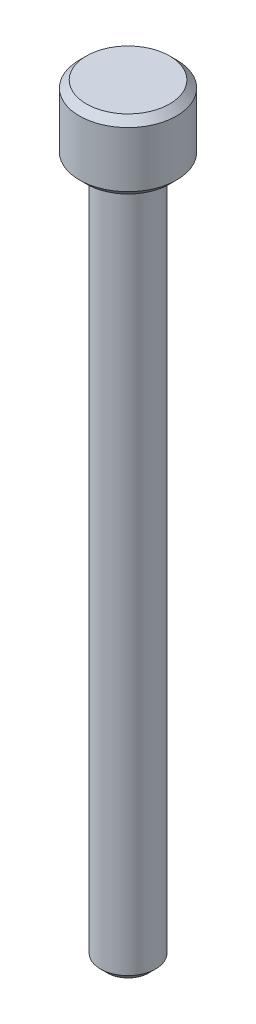
ISO-10303-21;
HEADER;
FILE_DESCRIPTION(('STEP AP214'),'2;1');
FILE_NAME('part.step','',(''),(''),'','','');
FILE_SCHEMA(('AUTOMOTIVE_DESIGN { 1 0 10303 214 1 1 1 1 }'));
ENDSEC;
DATA;
#1=APPLICATION_CONTEXT('core data for automotive mechanical design processes');
#2=APPLICATION_PROTOCOL_DEFINITION('international standard','automotive_design',2000,#1);
#3=PRODUCT_CONTEXT('',#1,'mechanical');
#4=PRODUCT('Part','Part','',(#3));
#5=PRODUCT_RELATED_PRODUCT_CATEGORY('part','',(#4));
#6=PRODUCT_DEFINITION_FORMATION('','',#4);
#7=PRODUCT_DEFINITION_CONTEXT('part definition',#1,'design');
#8=PRODUCT_DEFINITION('design','',#6,#7);
#9=PRODUCT_DEFINITION_SHAPE('','',#8);
#10=(LENGTH_UNIT() NAMED_UNIT(*) SI_UNIT(.MILLI.,.METRE.));
#11=(NAMED_UNIT(*) PLANE_ANGLE_UNIT() SI_UNIT($,.RADIAN.));
#12=(NAMED_UNIT(*) SI_UNIT($,.STERADIAN.) SOLID_ANGLE_UNIT());
#13=UNCERTAINTY_MEASURE_WITH_UNIT(LENGTH_MEASURE(1.E-05),#10,'distance_accuracy_value','');
#14=(GEOMETRIC_REPRESENTATION_CONTEXT(3) GLOBAL_UNCERTAINTY_ASSIGNED_CONTEXT((#13)) GLOBAL_UNIT_ASSIGNED_CONTEXT((#10,
#11,#12)) REPRESENTATION_CONTEXT('',''));
#15=CARTESIAN_POINT('',(0.,0.,0.));
#16=DIRECTION('',(0.,0.,1.));
#17=DIRECTION('',(1.,0.,0.));
#18=AXIS2_PLACEMENT_3D('',#15,#16,#17);
#19=CARTESIAN_POINT('',(6.,110.,0.));
#20=DIRECTION('',(0.,1.,0.));
#21=DIRECTION('',(0.,0.,1.));
#22=AXIS2_PLACEMENT_3D('',#19,#20,#21);
#23=PLANE('',#22);
#24=CARTESIAN_POINT('',(0.,110.,0.));
#25=DIRECTION('',(0.,-1.,0.));
#26=DIRECTION('',(0.,0.,-1.));
#27=AXIS2_PLACEMENT_3D('',#24,#25,#26);
#28=CIRCLE('',#27,6.);
#29=CARTESIAN_POINT('',(0.,110.,-6.));
#30=VERTEX_POINT('',#29);
#31=EDGE_CURVE('E10',#30,#30,#28,.T.);
#32=ORIENTED_EDGE('',*,*,#31,.F.);
#33=EDGE_LOOP('',(#32));
#34=FACE_BOUND('',#33,.T.);
#35=ADVANCED_FACE('F41',(#34),#23,.T.);
#36=CARTESIAN_POINT('',(0.,109.,0.));
#37=DIRECTION('',(0.,-1.,0.));
#38=DIRECTION('',(0.,0.,-1.));
#39=AXIS2_PLACEMENT_3D('',#36,#37,#38);
#40=CONICAL_SURFACE('',#39,7.,0.785398163397446);
#41=ORIENTED_EDGE('',*,*,#31,.T.);
#42=EDGE_LOOP('',(#41));
#43=FACE_BOUND('',#42,.T.);
#44=CARTESIAN_POINT('',(0.,109.,0.));
#45=DIRECTION('',(0.,-1.,0.));
#46=DIRECTION('',(0.,0.,-1.));
#47=AXIS2_PLACEMENT_3D('',#44,#45,#46);
#48=CIRCLE('',#47,7.);
#49=CARTESIAN_POINT('',(0.,109.,-7.));
#50=VERTEX_POINT('',#49);
#51=EDGE_CURVE('E47',#50,#50,#48,.T.);
#52=ORIENTED_EDGE('',*,*,#51,.F.);
#53=EDGE_LOOP('',(#52));
#54=FACE_BOUND('',#53,.T.);
#55=ADVANCED_FACE('F89',(#43,#54),#40,.T.);
#56=CARTESIAN_POINT('',(0.,0.,0.));
#57=DIRECTION('',(0.,-1.,0.));
#58=DIRECTION('',(0.,0.,-1.));
#59=AXIS2_PLACEMENT_3D('',#56,#57,#58);
#60=CYLINDRICAL_SURFACE('',#59,7.);
#61=ORIENTED_EDGE('',*,*,#51,.T.);
#62=EDGE_LOOP('',(#61));
#63=FACE_BOUND('',#62,.T.);
#64=CARTESIAN_POINT('',(0.,101.,0.));
#65=DIRECTION('',(0.,-1.,0.));
#66=DIRECTION('',(0.,0.,-1.));
#67=AXIS2_PLACEMENT_3D('',#64,#65,#66);
#68=CIRCLE('',#67,7.);
#69=CARTESIAN_POINT('',(0.,101.,-7.));
#70=VERTEX_POINT('',#69);
#71=EDGE_CURVE('E51',#70,#70,#68,.T.);
#72=ORIENTED_EDGE('',*,*,#71,.F.);
#73=EDGE_LOOP('',(#72));
#74=FACE_BOUND('',#73,.T.);
#75=ADVANCED_FACE('F94',(#63,#74),#60,.T.);
#76=CARTESIAN_POINT('',(0.,100.,0.));
#77=DIRECTION('',(0.,1.,0.));
#78=DIRECTION('',(0.,0.,1.));
#79=AXIS2_PLACEMENT_3D('',#76,#77,#78);
#80=CONICAL_SURFACE('',#79,6.,0.785398163397448);
#81=ORIENTED_EDGE('',*,*,#71,.T.);
#82=EDGE_LOOP('',(#81));
#83=FACE_BOUND('',#82,.T.);
#84=CARTESIAN_POINT('',(0.,100.,0.));
#85=DIRECTION('',(0.,-1.,0.));
#86=DIRECTION('',(0.,0.,-1.));
#87=AXIS2_PLACEMENT_3D('',#84,#85,#86);
#88=CIRCLE('',#87,6.);
#89=CARTESIAN_POINT('',(0.,100.,-6.));
#90=VERTEX_POINT('',#89);
#91=EDGE_CURVE('E55',#90,#90,#88,.T.);
#92=ORIENTED_EDGE('',*,*,#91,.F.);
#93=EDGE_LOOP('',(#92));
#94=FACE_BOUND('',#93,.T.);
#95=ADVANCED_FACE('F98',(#83,#94),#80,.T.);
#96=CARTESIAN_POINT('',(4.96875,100.,0.));
#97=DIRECTION('',(0.,-1.,0.));
#98=DIRECTION('',(0.,0.,-1.));
#99=AXIS2_PLACEMENT_3D('',#96,#97,#98);
#100=PLANE('',#99);
#101=ORIENTED_EDGE('',*,*,#91,.T.);
#102=EDGE_LOOP('',(#101));
#103=FACE_BOUND('',#102,.T.);
#104=CARTESIAN_POINT('',(0.,100.,0.));
#105=DIRECTION('',(0.,-1.,0.));
#106=DIRECTION('',(0.,0.,-1.));
#107=AXIS2_PLACEMENT_3D('',#104,#105,#106);
#108=CIRCLE('',#107,4.96875);
#109=CARTESIAN_POINT('',(0.,100.,-4.96875));
#110=VERTEX_POINT('',#109);
#111=EDGE_CURVE('E60',#110,#110,#108,.T.);
#112=ORIENTED_EDGE('',*,*,#111,.F.);
#113=EDGE_LOOP('',(#112));
#114=FACE_BOUND('',#113,.T.);
#115=ADVANCED_FACE('F104',(#103,#114),#100,.T.);
#116=CARTESIAN_POINT('',(0.,99.,0.));
#117=DIRECTION('',(0.,1.,0.));
#118=DIRECTION('',(0.,0.,1.));
#119=AXIS2_PLACEMENT_3D('',#116,#117,#118);
#120=CONICAL_SURFACE('',#119,3.96875,0.785398163397447);
#121=ORIENTED_EDGE('',*,*,#111,.T.);
#122=EDGE_LOOP('',(#121));
#123=FACE_BOUND('',#122,.T.);
#124=CARTESIAN_POINT('',(0.,99.,0.));
#125=DIRECTION('',(0.,-1.,0.));
#126=DIRECTION('',(0.,0.,-1.));
#127=AXIS2_PLACEMENT_3D('',#124,#125,#126);
#128=CIRCLE('',#127,3.96875);
#129=CARTESIAN_POINT('',(0.,99.,-3.96875));
#130=VERTEX_POINT('',#129);
#131=EDGE_CURVE('E63',#130,#130,#128,.T.);
#132=ORIENTED_EDGE('',*,*,#131,.F.);
#133=EDGE_LOOP('',(#132));
#134=FACE_BOUND('',#133,.T.);
#135=ADVANCED_FACE('F85',(#123,#134),#120,.T.);
#136=CARTESIAN_POINT('',(0.,0.,0.));
#137=DIRECTION('',(0.,-1.,0.));
#138=DIRECTION('',(0.,0.,-1.));
#139=AXIS2_PLACEMENT_3D('',#136,#137,#138);
#140=CYLINDRICAL_SURFACE('',#139,3.96875);
#141=ORIENTED_EDGE('',*,*,#131,.T.);
#142=EDGE_LOOP('',(#141));
#143=FACE_BOUND('',#142,.T.);
#144=CARTESIAN_POINT('',(0.,1.,0.));
#145=DIRECTION('',(0.,-1.,0.));
#146=DIRECTION('',(0.,0.,-1.));
#147=AXIS2_PLACEMENT_3D('',#144,#145,#146);
#148=CIRCLE('',#147,3.96875);
#149=CARTESIAN_POINT('',(0.,1.,-3.96875));
#150=VERTEX_POINT('',#149);
#151=EDGE_CURVE('E66',#150,#150,#148,.T.);
#152=ORIENTED_EDGE('',*,*,#151,.F.);
#153=EDGE_LOOP('',(#152));
#154=FACE_BOUND('',#153,.T.);
#155=ADVANCED_FACE('F77',(#143,#154),#140,.T.);
#156=CARTESIAN_POINT('',(0.,0.,0.));
#157=DIRECTION('',(0.,1.,0.));
#158=DIRECTION('',(0.,0.,1.));
#159=AXIS2_PLACEMENT_3D('',#156,#157,#158);
#160=CONICAL_SURFACE('',#159,2.96875,0.785398163397447);
#161=ORIENTED_EDGE('',*,*,#151,.T.);
#162=EDGE_LOOP('',(#161));
#163=FACE_BOUND('',#162,.T.);
#164=CARTESIAN_POINT('',(0.,0.,0.));
#165=DIRECTION('',(0.,-1.,0.));
#166=DIRECTION('',(0.,0.,-1.));
#167=AXIS2_PLACEMENT_3D('',#164,#165,#166);
#168=CIRCLE('',#167,2.96875);
#169=CARTESIAN_POINT('',(0.,0.,-2.96875));
#170=VERTEX_POINT('',#169);
#171=EDGE_CURVE('E69',#170,#170,#168,.T.);
#172=ORIENTED_EDGE('',*,*,#171,.F.);
#173=EDGE_LOOP('',(#172));
#174=FACE_BOUND('',#173,.T.);
#175=ADVANCED_FACE('F75',(#163,#174),#160,.T.);
#176=CARTESIAN_POINT('',(2.96875,0.,0.));
#177=DIRECTION('',(0.,-1.,0.));
#178=DIRECTION('',(0.,0.,-1.));
#179=AXIS2_PLACEMENT_3D('',#176,#177,#178);
#180=PLANE('',#179);
#181=ORIENTED_EDGE('',*,*,#171,.T.);
#182=EDGE_LOOP('',(#181));
#183=FACE_BOUND('',#182,.T.);
#184=ADVANCED_FACE('F73',(#183),#180,.T.);
#185=CLOSED_SHELL('',(#35,#55,#75,#95,#115,#135,#155,#175,#184));
#186=MANIFOLD_SOLID_BREP('B2',#185);
#187=ADVANCED_BREP_SHAPE_REPRESENTATION('',(#18,#186),#14);
#188=SHAPE_DEFINITION_REPRESENTATION(#9,#187);
ENDSEC;
END-ISO-10303-21;
